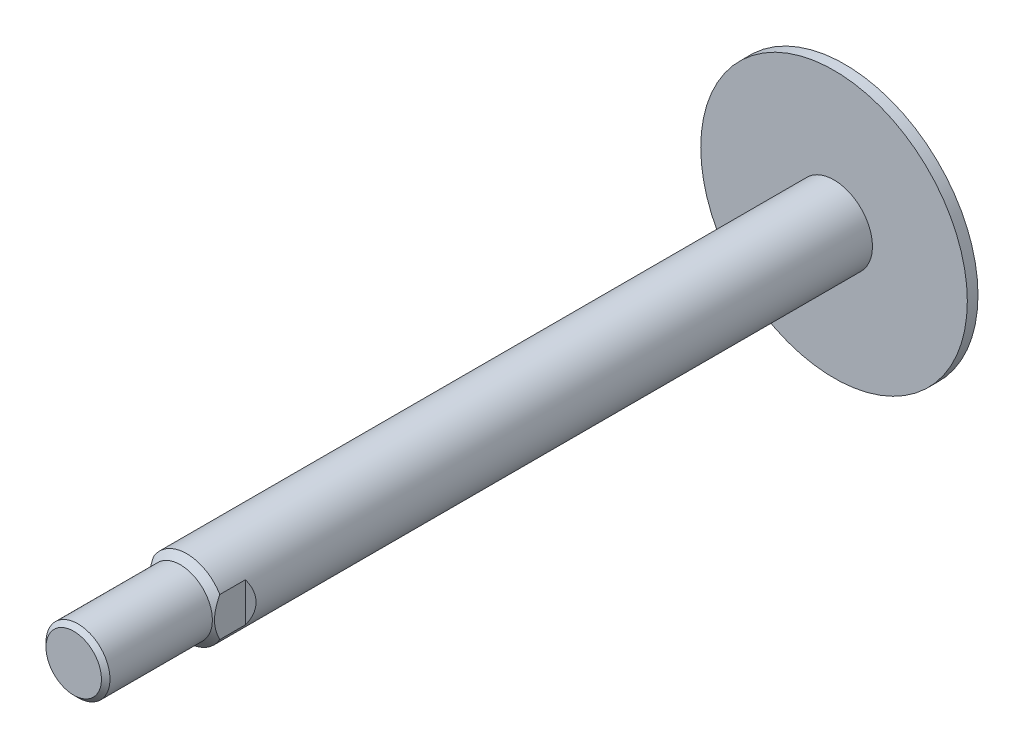
ISO-10303-21;
HEADER;
FILE_DESCRIPTION(('STEP AP214'),'2;1');
FILE_NAME('part.step','',(''),(''),'','','');
FILE_SCHEMA(('AUTOMOTIVE_DESIGN { 1 0 10303 214 1 1 1 1 }'));
ENDSEC;
DATA;
#1=APPLICATION_CONTEXT('core data for automotive mechanical design processes');
#2=APPLICATION_PROTOCOL_DEFINITION('international standard','automotive_design',2000,#1);
#3=PRODUCT_CONTEXT('',#1,'mechanical');
#4=PRODUCT('Part','Part','',(#3));
#5=PRODUCT_RELATED_PRODUCT_CATEGORY('part','',(#4));
#6=PRODUCT_DEFINITION_FORMATION('','',#4);
#7=PRODUCT_DEFINITION_CONTEXT('part definition',#1,'design');
#8=PRODUCT_DEFINITION('design','',#6,#7);
#9=PRODUCT_DEFINITION_SHAPE('','',#8);
#10=(LENGTH_UNIT() NAMED_UNIT(*) SI_UNIT(.MILLI.,.METRE.));
#11=(NAMED_UNIT(*) PLANE_ANGLE_UNIT() SI_UNIT($,.RADIAN.));
#12=(NAMED_UNIT(*) SI_UNIT($,.STERADIAN.) SOLID_ANGLE_UNIT());
#13=UNCERTAINTY_MEASURE_WITH_UNIT(LENGTH_MEASURE(1.E-05),#10,'distance_accuracy_value','');
#14=(GEOMETRIC_REPRESENTATION_CONTEXT(3) GLOBAL_UNCERTAINTY_ASSIGNED_CONTEXT((#13)) GLOBAL_UNIT_ASSIGNED_CONTEXT((#10,
#11,#12)) REPRESENTATION_CONTEXT('',''));
#15=CARTESIAN_POINT('',(0.,0.,0.));
#16=DIRECTION('',(0.,0.,1.));
#17=DIRECTION('',(1.,0.,0.));
#18=AXIS2_PLACEMENT_3D('',#15,#16,#17);
#19=CARTESIAN_POINT('',(0.,0.,361.5));
#20=DIRECTION('',(0.,0.,-1.));
#21=DIRECTION('',(-1.,0.,0.));
#22=AXIS2_PLACEMENT_3D('',#19,#20,#21);
#23=CYLINDRICAL_SURFACE('',#22,18.);
#24=DIRECTION('',(0.,0.,-1.));
#25=VECTOR('',#24,1.);
#26=CARTESIAN_POINT('',(-15.5,-9.15150260886164,361.5));
#27=LINE('',#26,#25);
#28=CARTESIAN_POINT('',(-15.5,-9.15150260886162,308.5));
#29=VERTEX_POINT('',#28);
#30=CARTESIAN_POINT('',(-15.5,-9.15150260886163,296.5));
#31=VERTEX_POINT('',#30);
#32=EDGE_CURVE('E48',#29,#31,#27,.T.);
#33=ORIENTED_EDGE('',*,*,#32,.T.);
#34=CARTESIAN_POINT('',(0.,0.,312.));
#35=DIRECTION('',(0.707106781186545,0.,-0.70710678118655));
#36=DIRECTION('',(-0.70710678118655,0.,-0.707106781186545));
#37=AXIS2_PLACEMENT_3D('',#34,#35,#36);
#38=ELLIPSE('',#37,25.4558441227156,18.);
#39=CARTESIAN_POINT('',(-15.5,9.15150260886163,296.5));
#40=VERTEX_POINT('',#39);
#41=EDGE_CURVE('E11',#31,#40,#38,.T.);
#42=ORIENTED_EDGE('',*,*,#41,.T.);
#43=DIRECTION('',(0.,0.,-1.));
#44=VECTOR('',#43,1.);
#45=CARTESIAN_POINT('',(-15.5,9.15150260886164,361.5));
#46=LINE('',#45,#44);
#47=CARTESIAN_POINT('',(-15.5,9.15150260886162,308.5));
#48=VERTEX_POINT('',#47);
#49=EDGE_CURVE('E79',#40,#48,#46,.F.);
#50=ORIENTED_EDGE('',*,*,#49,.T.);
#51=CARTESIAN_POINT('',(0.,0.,308.5));
#52=DIRECTION('',(0.,0.,-1.));
#53=DIRECTION('',(-1.,0.,0.));
#54=AXIS2_PLACEMENT_3D('',#51,#52,#53);
#55=CIRCLE('',#54,18.);
#56=CARTESIAN_POINT('',(15.5,9.15150260886149,308.5));
#57=VERTEX_POINT('',#56);
#58=EDGE_CURVE('E56',#48,#57,#55,.T.);
#59=ORIENTED_EDGE('',*,*,#58,.T.);
#60=DIRECTION('',(0.,0.,-1.));
#61=VECTOR('',#60,1.);
#62=CARTESIAN_POINT('',(15.5,9.15150260886148,361.5));
#63=LINE('',#62,#61);
#64=CARTESIAN_POINT('',(15.5,9.1515026088615,296.5));
#65=VERTEX_POINT('',#64);
#66=EDGE_CURVE('E94',#57,#65,#63,.T.);
#67=ORIENTED_EDGE('',*,*,#66,.T.);
#68=CARTESIAN_POINT('',(0.,0.,312.));
#69=DIRECTION('',(-0.707106781186546,0.,-0.707106781186549));
#70=DIRECTION('',(0.707106781186549,0.,-0.707106781186546));
#71=AXIS2_PLACEMENT_3D('',#68,#69,#70);
#72=ELLIPSE('',#71,25.4558441227156,18.);
#73=CARTESIAN_POINT('',(15.5,-9.1515026088615,296.5));
#74=VERTEX_POINT('',#73);
#75=EDGE_CURVE('E124',#65,#74,#72,.T.);
#76=ORIENTED_EDGE('',*,*,#75,.T.);
#77=DIRECTION('',(0.,0.,-1.));
#78=VECTOR('',#77,1.);
#79=CARTESIAN_POINT('',(15.5,-9.15150260886148,361.5));
#80=LINE('',#79,#78);
#81=CARTESIAN_POINT('',(15.5,-9.15150260886149,308.5));
#82=VERTEX_POINT('',#81);
#83=EDGE_CURVE('E89',#74,#82,#80,.F.);
#84=ORIENTED_EDGE('',*,*,#83,.T.);
#85=EDGE_CURVE('E85',#82,#29,#55,.T.);
#86=ORIENTED_EDGE('',*,*,#85,.T.);
#87=EDGE_LOOP('',(#33,#42,#50,#59,#67,#76,#84,#86));
#88=FACE_BOUND('',#87,.T.);
#89=CARTESIAN_POINT('',(0.,0.,5.));
#90=DIRECTION('',(0.,0.,-1.));
#91=DIRECTION('',(-1.,0.,0.));
#92=AXIS2_PLACEMENT_3D('',#89,#90,#91);
#93=CIRCLE('',#92,18.);
#94=CARTESIAN_POINT('',(-18.,0.,5.));
#95=VERTEX_POINT('',#94);
#96=EDGE_CURVE('E110',#95,#95,#93,.T.);
#97=ORIENTED_EDGE('',*,*,#96,.F.);
#98=EDGE_LOOP('',(#97));
#99=FACE_BOUND('',#98,.T.);
#100=ADVANCED_FACE('F34',(#88,#99),#23,.T.);
#101=CARTESIAN_POINT('',(0.,0.,5.));
#102=DIRECTION('',(0.,0.,-1.));
#103=DIRECTION('',(-1.,0.,0.));
#104=AXIS2_PLACEMENT_3D('',#101,#102,#103);
#105=CYLINDRICAL_SURFACE('',#104,62.5);
#106=CARTESIAN_POINT('',(0.,0.,5.));
#107=DIRECTION('',(0.,0.,-1.));
#108=DIRECTION('',(-1.,0.,0.));
#109=AXIS2_PLACEMENT_3D('',#106,#107,#108);
#110=CIRCLE('',#109,62.5);
#111=CARTESIAN_POINT('',(-62.5,0.,5.));
#112=VERTEX_POINT('',#111);
#113=EDGE_CURVE('E107',#112,#112,#110,.T.);
#114=ORIENTED_EDGE('',*,*,#113,.T.);
#115=EDGE_LOOP('',(#114));
#116=FACE_BOUND('',#115,.T.);
#117=CARTESIAN_POINT('',(0.,0.,0.));
#118=DIRECTION('',(0.,0.,-1.));
#119=DIRECTION('',(-1.,0.,0.));
#120=AXIS2_PLACEMENT_3D('',#117,#118,#119);
#121=CIRCLE('',#120,62.5);
#122=CARTESIAN_POINT('',(-62.5,0.,0.));
#123=VERTEX_POINT('',#122);
#124=EDGE_CURVE('E106',#123,#123,#121,.T.);
#125=ORIENTED_EDGE('',*,*,#124,.F.);
#126=EDGE_LOOP('',(#125));
#127=FACE_BOUND('',#126,.T.);
#128=ADVANCED_FACE('F146',(#116,#127),#105,.T.);
#129=CARTESIAN_POINT('',(0.,0.,5.));
#130=DIRECTION('',(0.,0.,-1.));
#131=DIRECTION('',(-1.,0.,0.));
#132=AXIS2_PLACEMENT_3D('',#129,#130,#131);
#133=PLANE('',#132);
#134=ORIENTED_EDGE('',*,*,#96,.T.);
#135=EDGE_LOOP('',(#134));
#136=FACE_BOUND('',#135,.T.);
#137=ORIENTED_EDGE('',*,*,#113,.F.);
#138=EDGE_LOOP('',(#137));
#139=FACE_BOUND('',#138,.T.);
#140=ADVANCED_FACE('F150',(#136,#139),#133,.F.);
#141=CARTESIAN_POINT('',(0.,0.,0.));
#142=DIRECTION('',(0.,0.,1.));
#143=DIRECTION('',(1.,0.,0.));
#144=AXIS2_PLACEMENT_3D('',#141,#142,#143);
#145=PLANE('',#144);
#146=ORIENTED_EDGE('',*,*,#124,.T.);
#147=EDGE_LOOP('',(#146));
#148=FACE_BOUND('',#147,.T.);
#149=ADVANCED_FACE('F156',(#148),#145,.F.);
#150=CARTESIAN_POINT('',(0.,0.,361.5));
#151=DIRECTION('',(0.,0.,-1.));
#152=DIRECTION('',(-1.,0.,0.));
#153=AXIS2_PLACEMENT_3D('',#150,#151,#152);
#154=CONICAL_SURFACE('',#153,12.9999999999999,0.785398163397458);
#155=CARTESIAN_POINT('',(0.,0.,359.5));
#156=DIRECTION('',(0.,0.,-1.));
#157=DIRECTION('',(-1.,0.,0.));
#158=AXIS2_PLACEMENT_3D('',#155,#156,#157);
#159=CIRCLE('',#158,15.);
#160=CARTESIAN_POINT('',(-15.,0.,359.5));
#161=VERTEX_POINT('',#160);
#162=EDGE_CURVE('E100',#161,#161,#159,.T.);
#163=ORIENTED_EDGE('',*,*,#162,.F.);
#164=EDGE_LOOP('',(#163));
#165=FACE_BOUND('',#164,.T.);
#166=CARTESIAN_POINT('',(0.,0.,361.5));
#167=DIRECTION('',(0.,0.,-1.));
#168=DIRECTION('',(-1.,0.,0.));
#169=AXIS2_PLACEMENT_3D('',#166,#167,#168);
#170=CIRCLE('',#169,12.9999999999999);
#171=CARTESIAN_POINT('',(-12.9999999999999,0.,361.5));
#172=VERTEX_POINT('',#171);
#173=EDGE_CURVE('E103',#172,#172,#170,.T.);
#174=ORIENTED_EDGE('',*,*,#173,.T.);
#175=EDGE_LOOP('',(#174));
#176=FACE_BOUND('',#175,.T.);
#177=ADVANCED_FACE('F162',(#165,#176),#154,.T.);
#178=CARTESIAN_POINT('',(0.,0.,0.));
#179=DIRECTION('',(0.,0.,-1.));
#180=DIRECTION('',(-1.,0.,0.));
#181=AXIS2_PLACEMENT_3D('',#178,#179,#180);
#182=CYLINDRICAL_SURFACE('',#181,15.);
#183=CARTESIAN_POINT('',(0.,0.,311.5));
#184=DIRECTION('',(0.,0.,-1.));
#185=DIRECTION('',(-1.,0.,0.));
#186=AXIS2_PLACEMENT_3D('',#183,#184,#185);
#187=CIRCLE('',#186,15.);
#188=CARTESIAN_POINT('',(-15.,0.,311.5));
#189=VERTEX_POINT('',#188);
#190=EDGE_CURVE('E97',#189,#189,#187,.T.);
#191=ORIENTED_EDGE('',*,*,#190,.F.);
#192=EDGE_LOOP('',(#191));
#193=FACE_BOUND('',#192,.T.);
#194=ORIENTED_EDGE('',*,*,#162,.T.);
#195=EDGE_LOOP('',(#194));
#196=FACE_BOUND('',#195,.T.);
#197=ADVANCED_FACE('F167',(#193,#196),#182,.T.);
#198=CARTESIAN_POINT('',(0.,0.,311.5));
#199=DIRECTION('',(0.,0.,-1.));
#200=DIRECTION('',(-1.,0.,0.));
#201=AXIS2_PLACEMENT_3D('',#198,#199,#200);
#202=CONICAL_SURFACE('',#201,15.,0.785398163397453);
#203=ORIENTED_EDGE('',*,*,#58,.F.);
#204=CARTESIAN_POINT('',(-15.5,-29.6331590894657,293.057899025008));
#205=CARTESIAN_POINT('',(-15.5,-29.2882625990623,293.363509543435));
#206=CARTESIAN_POINT('',(-15.5,-28.9428010835177,293.668482067376));
#207=CARTESIAN_POINT('',(-15.5,-28.2506310811318,294.277012456281));
#208=CARTESIAN_POINT('',(-15.5,-27.9039225873511,294.580570313353));
#209=CARTESIAN_POINT('',(-15.5,-26.8616807875897,295.488975228847));
#210=CARTESIAN_POINT('',(-15.5,-26.1641068092566,296.091486495656));
#211=CARTESIAN_POINT('',(-15.5,-24.7590802339344,297.291645290907));
#212=CARTESIAN_POINT('',(-15.5,-24.0515965612587,297.889256473323));
#213=CARTESIAN_POINT('',(-15.5,-22.6285413261069,299.074725884789));
#214=CARTESIAN_POINT('',(-15.5,-21.9129701883699,299.662584622056));
#215=CARTESIAN_POINT('',(-15.5,-20.8091963084371,300.553483790579));
#216=CARTESIAN_POINT('',(-15.5,-20.4246008288361,300.860995476566));
#217=CARTESIAN_POINT('',(-15.5,-19.6521982622197,301.471955809443));
#218=CARTESIAN_POINT('',(-15.5,-19.2643912073794,301.775404496959));
#219=CARTESIAN_POINT('',(-15.5,-18.4850794593418,302.377665859362));
#220=CARTESIAN_POINT('',(-15.5,-18.0935741189662,302.676477697711));
#221=CARTESIAN_POINT('',(-15.5,-17.3064528190443,303.268640438536));
#222=CARTESIAN_POINT('',(-15.5,-16.9108368833152,303.561991372626));
#223=CARTESIAN_POINT('',(-15.5,-16.115728472952,304.141717178887));
#224=CARTESIAN_POINT('',(-15.5,-15.7162453197279,304.428104814753));
#225=CARTESIAN_POINT('',(-15.5,-14.9119734718651,304.99337081436));
#226=CARTESIAN_POINT('',(-15.5,-14.5071846343288,305.272248975228));
#227=CARTESIAN_POINT('',(-15.5,-13.6917121217347,305.820976175633));
#228=CARTESIAN_POINT('',(-15.5,-13.2810304177913,306.090828138186));
#229=CARTESIAN_POINT('',(-15.5,-12.4528419185263,306.619816128242));
#230=CARTESIAN_POINT('',(-15.5,-12.0353357112343,306.878953072278));
#231=CARTESIAN_POINT('',(-15.5,-11.3241331334941,307.305410455095));
#232=CARTESIAN_POINT('',(-15.5,-11.0324790932323,307.476137250042));
#233=CARTESIAN_POINT('',(-15.5,-10.4451804347925,307.810604354562));
#234=CARTESIAN_POINT('',(-15.5,-10.1495358044062,307.974344642754));
#235=CARTESIAN_POINT('',(-15.5,-9.55384170738457,308.293883206033));
#236=CARTESIAN_POINT('',(-15.5,-9.25379074897016,308.449678707636));
#237=CARTESIAN_POINT('',(-15.5,-8.64909067807859,308.752092797227));
#238=CARTESIAN_POINT('',(-15.5,-8.34444158955415,308.898711433));
#239=CARTESIAN_POINT('',(-15.5,-7.73311691755781,309.180121910434));
#240=CARTESIAN_POINT('',(-15.5,-7.42648626949582,309.315010752003));
#241=CARTESIAN_POINT('',(-15.5,-6.80830067064909,309.572980230311));
#242=CARTESIAN_POINT('',(-15.5,-6.49674535514862,309.696059987665));
#243=CARTESIAN_POINT('',(-15.5,-5.55484283489775,310.04501278696));
#244=CARTESIAN_POINT('',(-15.5,-4.91675132947446,310.250838615262));
#245=CARTESIAN_POINT('',(-15.5,-3.81891797146642,310.542390627933));
#246=CARTESIAN_POINT('',(-15.5,-3.36380280397929,310.64560844073));
#247=CARTESIAN_POINT('',(-15.5,-2.44661443164834,310.814560418997));
#248=CARTESIAN_POINT('',(-15.5,-1.98454248842102,310.880301298859));
#249=CARTESIAN_POINT('',(-15.5,-1.05772460505567,310.970775980213));
#250=CARTESIAN_POINT('',(-15.5,-0.592990568557248,310.995630136601));
#251=CARTESIAN_POINT('',(-15.5,0.336845196422443,311.003311648353));
#252=CARTESIAN_POINT('',(-15.5,0.801946933536979,310.986137985767));
#253=CARTESIAN_POINT('',(-15.5,1.72588496649731,310.910969425463));
#254=CARTESIAN_POINT('',(-15.5,2.18474222429631,310.853227849534));
#255=CARTESIAN_POINT('',(-15.5,3.09610491211335,310.700192901746));
#256=CARTESIAN_POINT('',(-15.5,3.54860970737757,310.604895804519));
#257=CARTESIAN_POINT('',(-15.5,4.45011094085283,310.379803069245));
#258=CARTESIAN_POINT('',(-15.5,4.89901500065671,310.249641810613));
#259=CARTESIAN_POINT('',(-15.5,5.78712301492144,309.960214156325));
#260=CARTESIAN_POINT('',(-15.5,6.2263288808489,309.800953554447));
#261=CARTESIAN_POINT('',(-15.5,7.27332518600462,309.387604124827));
#262=CARTESIAN_POINT('',(-15.5,7.87632459192405,309.121422419121));
#263=CARTESIAN_POINT('',(-15.5,9.06453222811885,308.551638433521));
#264=CARTESIAN_POINT('',(-15.5,9.64972914138347,308.24801294579));
#265=CARTESIAN_POINT('',(-15.5,10.8064399913364,307.610973970717));
#266=CARTESIAN_POINT('',(-15.5,11.3778937639916,307.277452100319));
#267=CARTESIAN_POINT('',(-15.5,12.507036627568,306.588293086944));
#268=CARTESIAN_POINT('',(-15.5,13.0647287053209,306.232660802835));
#269=CARTESIAN_POINT('',(-15.5,14.1399340557965,305.523028131275));
#270=CARTESIAN_POINT('',(-15.5,14.6580287793132,305.169904212683));
#271=CARTESIAN_POINT('',(-15.5,15.6855213215681,304.451171956934));
#272=CARTESIAN_POINT('',(-15.5,16.1949184004729,304.085562565603));
#273=CARTESIAN_POINT('',(-15.5,17.201706264186,303.347623539255));
#274=CARTESIAN_POINT('',(-15.5,17.6991640861449,302.975385154399));
#275=CARTESIAN_POINT('',(-15.5,18.4406284208438,302.41097429362));
#276=CARTESIAN_POINT('',(-15.5,18.6869660813711,302.221852126709));
#277=CARTESIAN_POINT('',(-15.5,19.1781996397318,301.841752674166));
#278=CARTESIAN_POINT('',(-15.5,19.4230955619774,301.650775420092));
#279=CARTESIAN_POINT('',(-15.5,19.6673304531085,301.458955949247));
#280=B_SPLINE_CURVE_WITH_KNOTS('',3,(#204,#205,#206,#207,#208,#209,#210,#211,#212,#213,#214,
#215,#216,#217,#218,#219,#220,#221,#222,#223,#224,#225,#226,#227,#228,#229,#230,#231,#232,#233,
#234,#235,#236,#237,#238,#239,#240,#241,#242,#243,#244,#245,#246,#247,#248,#249,#250,#251,#252,
#253,#254,#255,#256,#257,#258,#259,#260,#261,#262,#263,#264,#265,#266,#267,#268,#269,#270,#271,
#272,#273,#274,#275,#276,#277,#278,#279),.UNSPECIFIED.,.F.,.F.,(4,2,2,2,2,2,2,2,2,2,2,2,2,2,2,2,
2,2,2,2,2,2,2,2,2,2,2,2,2,2,2,2,2,2,2,2,2,4),(0.,1.38244632907316,2.76490036340434,
5.53011184615856,8.30836626592069,11.0864754485678,12.5637125351151,14.040934839853,
15.5184206239325,16.9958978521052,18.4704239512581,19.9449898456759,21.4190735046865,
22.8930308127322,23.906798023331,24.9205683359832,25.9346901611949,26.9488067054343,
27.9535262982692,28.9583206514956,30.966230080728,32.3649335276118,33.7633863030221,
35.1577151532452,36.5520777756594,37.937809962392,39.3236796432347,40.7246941516902,
42.1254300167757,44.1010534715154,46.0779076402364,48.0622431437554,50.0461441109905,
51.9268991881031,53.8078134557228,55.6716367512158,56.6033189119845,57.5349852514158),.UNSPECIFIED.);
#281=EDGE_CURVE('E41',#48,#29,#280,.F.);
#282=ORIENTED_EDGE('',*,*,#281,.T.);
#283=ORIENTED_EDGE('',*,*,#85,.F.);
#284=CARTESIAN_POINT('',(15.5,-29.6331590894658,293.057899025008));
#285=CARTESIAN_POINT('',(15.5,-29.2882625990624,293.363509543435));
#286=CARTESIAN_POINT('',(15.5,-28.9428010835178,293.668482067376));
#287=CARTESIAN_POINT('',(15.5,-28.2506310811319,294.277012456281));
#288=CARTESIAN_POINT('',(15.5,-27.9039225873511,294.580570313353));
#289=CARTESIAN_POINT('',(15.5,-26.8616807875898,295.488975228847));
#290=CARTESIAN_POINT('',(15.5,-26.1641068092567,296.091486495656));
#291=CARTESIAN_POINT('',(15.5,-24.7590802339345,297.291645290907));
#292=CARTESIAN_POINT('',(15.5,-24.0515965612587,297.889256473323));
#293=CARTESIAN_POINT('',(15.5,-22.6285413261069,299.074725884789));
#294=CARTESIAN_POINT('',(15.5,-21.9129701883699,299.662584622056));
#295=CARTESIAN_POINT('',(15.5,-20.8091963084371,300.553483790579));
#296=CARTESIAN_POINT('',(15.5,-20.4246008288361,300.860995476566));
#297=CARTESIAN_POINT('',(15.5,-19.6521982622197,301.471955809443));
#298=CARTESIAN_POINT('',(15.5,-19.2643912073794,301.775404496959));
#299=CARTESIAN_POINT('',(15.5,-18.4850794593419,302.377665859362));
#300=CARTESIAN_POINT('',(15.5,-18.0935741189662,302.676477697711));
#301=CARTESIAN_POINT('',(15.5,-17.3064528190444,303.268640438536));
#302=CARTESIAN_POINT('',(15.5,-16.9108368833152,303.561991372626));
#303=CARTESIAN_POINT('',(15.5,-16.1157284729521,304.141717178887));
#304=CARTESIAN_POINT('',(15.5,-15.716245319728,304.428104814753));
#305=CARTESIAN_POINT('',(15.5,-14.9119734718652,304.99337081436));
#306=CARTESIAN_POINT('',(15.5,-14.5071846343288,305.272248975228));
#307=CARTESIAN_POINT('',(15.5,-13.6917121217348,305.820976175633));
#308=CARTESIAN_POINT('',(15.5,-13.2810304177913,306.090828138186));
#309=CARTESIAN_POINT('',(15.5,-12.4528419185263,306.619816128242));
#310=CARTESIAN_POINT('',(15.5,-12.0353357112343,306.878953072278));
#311=CARTESIAN_POINT('',(15.5,-11.3241331334941,307.305410455095));
#312=CARTESIAN_POINT('',(15.5,-11.0324790932323,307.476137250042));
#313=CARTESIAN_POINT('',(15.5,-10.4451804347925,307.810604354562));
#314=CARTESIAN_POINT('',(15.5,-10.1495358044062,307.974344642754));
#315=CARTESIAN_POINT('',(15.5,-9.55384170738457,308.293883206033));
#316=CARTESIAN_POINT('',(15.5,-9.25379074897016,308.449678707636));
#317=CARTESIAN_POINT('',(15.5,-8.6490906780786,308.752092797227));
#318=CARTESIAN_POINT('',(15.5,-8.34444158955416,308.898711432999));
#319=CARTESIAN_POINT('',(15.5,-7.73311691755782,309.180121910434));
#320=CARTESIAN_POINT('',(15.5,-7.42648626949581,309.315010752003));
#321=CARTESIAN_POINT('',(15.5,-6.80830067064908,309.572980230311));
#322=CARTESIAN_POINT('',(15.5,-6.49674535514863,309.696059987664));
#323=CARTESIAN_POINT('',(15.5,-5.55484283489778,310.04501278696));
#324=CARTESIAN_POINT('',(15.5,-4.91675132947448,310.250838615262));
#325=CARTESIAN_POINT('',(15.5,-3.81891797146644,310.542390627933));
#326=CARTESIAN_POINT('',(15.5,-3.36380280397931,310.64560844073));
#327=CARTESIAN_POINT('',(15.5,-2.44661443164836,310.814560418997));
#328=CARTESIAN_POINT('',(15.5,-1.98454248842104,310.880301298859));
#329=CARTESIAN_POINT('',(15.5,-1.05772460505568,310.970775980212));
#330=CARTESIAN_POINT('',(15.5,-0.592990568557261,310.995630136601));
#331=CARTESIAN_POINT('',(15.5,0.336845196422435,311.003311648353));
#332=CARTESIAN_POINT('',(15.5,0.801946933536976,310.986137985766));
#333=CARTESIAN_POINT('',(15.5,1.72588496649732,310.910969425463));
#334=CARTESIAN_POINT('',(15.5,2.18474222429633,310.853227849534));
#335=CARTESIAN_POINT('',(15.5,3.09610491211337,310.700192901746));
#336=CARTESIAN_POINT('',(15.5,3.54860970737758,310.604895804519));
#337=CARTESIAN_POINT('',(15.5,4.45011094085285,310.379803069245));
#338=CARTESIAN_POINT('',(15.5,4.89901500065674,310.249641810613));
#339=CARTESIAN_POINT('',(15.5,5.78712301492147,309.960214156325));
#340=CARTESIAN_POINT('',(15.5,6.22632888084893,309.800953554447));
#341=CARTESIAN_POINT('',(15.5,7.27332518600465,309.387604124827));
#342=CARTESIAN_POINT('',(15.5,7.87632459192409,309.121422419121));
#343=CARTESIAN_POINT('',(15.5,9.06453222811891,308.551638433521));
#344=CARTESIAN_POINT('',(15.5,9.64972914138353,308.24801294579));
#345=CARTESIAN_POINT('',(15.5,10.8064399913365,307.610973970717));
#346=CARTESIAN_POINT('',(15.5,11.3778937639917,307.277452100319));
#347=CARTESIAN_POINT('',(15.5,12.507036627568,306.588293086944));
#348=CARTESIAN_POINT('',(15.5,13.064728705321,306.232660802835));
#349=CARTESIAN_POINT('',(15.5,14.1399340557966,305.523028131275));
#350=CARTESIAN_POINT('',(15.5,14.6580287793133,305.169904212683));
#351=CARTESIAN_POINT('',(15.5,15.6855213215682,304.451171956934));
#352=CARTESIAN_POINT('',(15.5,16.194918400473,304.085562565603));
#353=CARTESIAN_POINT('',(15.5,17.2017062641861,303.347623539255));
#354=CARTESIAN_POINT('',(15.5,17.6991640861449,302.975385154399));
#355=CARTESIAN_POINT('',(15.5,18.4406284208439,302.41097429362));
#356=CARTESIAN_POINT('',(15.5,18.6869660813712,302.221852126709));
#357=CARTESIAN_POINT('',(15.5,19.1781996397319,301.841752674166));
#358=CARTESIAN_POINT('',(15.5,19.4230955619775,301.650775420092));
#359=CARTESIAN_POINT('',(15.5,19.6673304531086,301.458955949247));
#360=B_SPLINE_CURVE_WITH_KNOTS('',3,(#284,#285,#286,#287,#288,#289,#290,#291,#292,#293,#294,
#295,#296,#297,#298,#299,#300,#301,#302,#303,#304,#305,#306,#307,#308,#309,#310,#311,#312,#313,
#314,#315,#316,#317,#318,#319,#320,#321,#322,#323,#324,#325,#326,#327,#328,#329,#330,#331,#332,
#333,#334,#335,#336,#337,#338,#339,#340,#341,#342,#343,#344,#345,#346,#347,#348,#349,#350,#351,
#352,#353,#354,#355,#356,#357,#358,#359),.UNSPECIFIED.,.F.,.F.,(4,2,2,2,2,2,2,2,2,2,2,2,2,2,2,2,
2,2,2,2,2,2,2,2,2,2,2,2,2,2,2,2,2,2,2,2,2,4),(0.,1.3824463290732,2.76490036340436,
5.53011184615861,8.30836626592077,11.0864754485679,12.5637125351152,14.0409348398531,
15.5184206239326,16.9958978521052,18.4704239512582,19.944989845676,21.4190735046866,
22.8930308127323,23.9067980233311,24.9205683359833,25.934690161195,26.9488067054344,
27.9535262982693,28.9583206514957,30.966230080728,32.3649335276118,33.7633863030221,
35.1577151532452,36.5520777756595,37.9378099623922,39.3236796432348,40.7246941516903,
42.1254300167759,44.1010534715156,46.0779076402365,48.0622431437555,50.0461441109908,
51.9268991881033,53.8078134557229,55.671636751216,56.6033189119846,57.534985251416),.UNSPECIFIED.);
#361=EDGE_CURVE('E115',#82,#57,#360,.T.);
#362=ORIENTED_EDGE('',*,*,#361,.T.);
#363=EDGE_LOOP('',(#203,#282,#283,#362));
#364=FACE_BOUND('',#363,.T.);
#365=ORIENTED_EDGE('',*,*,#190,.T.);
#366=EDGE_LOOP('',(#365));
#367=FACE_BOUND('',#366,.T.);
#368=ADVANCED_FACE('F125',(#364,#367),#202,.T.);
#369=CARTESIAN_POINT('',(0.,0.,361.5));
#370=DIRECTION('',(0.,0.,1.));
#371=DIRECTION('',(1.,0.,0.));
#372=AXIS2_PLACEMENT_3D('',#369,#370,#371);
#373=PLANE('',#372);
#374=ORIENTED_EDGE('',*,*,#173,.F.);
#375=EDGE_LOOP('',(#374));
#376=FACE_BOUND('',#375,.T.);
#377=ADVANCED_FACE('F138',(#376),#373,.T.);
#378=CARTESIAN_POINT('',(18.,-62.5,294.));
#379=DIRECTION('',(-0.707106781186546,0.,-0.707106781186549));
#380=DIRECTION('',(-0.707106781186549,0.,0.707106781186546));
#381=AXIS2_PLACEMENT_3D('',#378,#379,#380);
#382=PLANE('',#381);
#383=ORIENTED_EDGE('',*,*,#75,.F.);
#384=DIRECTION('',(0.,1.,0.));
#385=VECTOR('',#384,1.);
#386=CARTESIAN_POINT('',(15.5,-62.5,296.5));
#387=LINE('',#386,#385);
#388=EDGE_CURVE('E86',#74,#65,#387,.T.);
#389=ORIENTED_EDGE('',*,*,#388,.F.);
#390=EDGE_LOOP('',(#383,#389));
#391=FACE_BOUND('',#390,.T.);
#392=ADVANCED_FACE('F133',(#391),#382,.F.);
#393=CARTESIAN_POINT('',(15.5,-62.5,296.5));
#394=DIRECTION('',(-1.,0.,0.));
#395=DIRECTION('',(0.,0.,1.));
#396=AXIS2_PLACEMENT_3D('',#393,#394,#395);
#397=PLANE('',#396);
#398=ORIENTED_EDGE('',*,*,#361,.F.);
#399=ORIENTED_EDGE('',*,*,#83,.F.);
#400=ORIENTED_EDGE('',*,*,#388,.T.);
#401=ORIENTED_EDGE('',*,*,#66,.F.);
#402=EDGE_LOOP('',(#398,#399,#400,#401));
#403=FACE_BOUND('',#402,.T.);
#404=ADVANCED_FACE('F129',(#403),#397,.F.);
#405=CARTESIAN_POINT('',(-17.9999999999999,-62.5,294.));
#406=DIRECTION('',(0.707106781186545,0.,-0.70710678118655));
#407=DIRECTION('',(-0.70710678118655,0.,-0.707106781186545));
#408=AXIS2_PLACEMENT_3D('',#405,#406,#407);
#409=PLANE('',#408);
#410=ORIENTED_EDGE('',*,*,#41,.F.);
#411=DIRECTION('',(0.,1.,0.));
#412=VECTOR('',#411,1.);
#413=CARTESIAN_POINT('',(-15.5,-62.5,296.5));
#414=LINE('',#413,#412);
#415=EDGE_CURVE('E77',#31,#40,#414,.T.);
#416=ORIENTED_EDGE('',*,*,#415,.T.);
#417=EDGE_LOOP('',(#410,#416));
#418=FACE_BOUND('',#417,.T.);
#419=ADVANCED_FACE('F76',(#418),#409,.F.);
#420=CARTESIAN_POINT('',(-15.5,-62.5,296.5));
#421=DIRECTION('',(1.,0.,0.));
#422=DIRECTION('',(0.,0.,-1.));
#423=AXIS2_PLACEMENT_3D('',#420,#421,#422);
#424=PLANE('',#423);
#425=ORIENTED_EDGE('',*,*,#281,.F.);
#426=ORIENTED_EDGE('',*,*,#49,.F.);
#427=ORIENTED_EDGE('',*,*,#415,.F.);
#428=ORIENTED_EDGE('',*,*,#32,.F.);
#429=EDGE_LOOP('',(#425,#426,#427,#428));
#430=FACE_BOUND('',#429,.T.);
#431=ADVANCED_FACE('F78',(#430),#424,.F.);
#432=CLOSED_SHELL('',(#100,#128,#140,#149,#177,#197,#368,#377,#392,#404,#419,#431));
#433=MANIFOLD_SOLID_BREP('B2',#432);
#434=ADVANCED_BREP_SHAPE_REPRESENTATION('',(#18,#433),#14);
#435=SHAPE_DEFINITION_REPRESENTATION(#9,#434);
ENDSEC;
END-ISO-10303-21;
